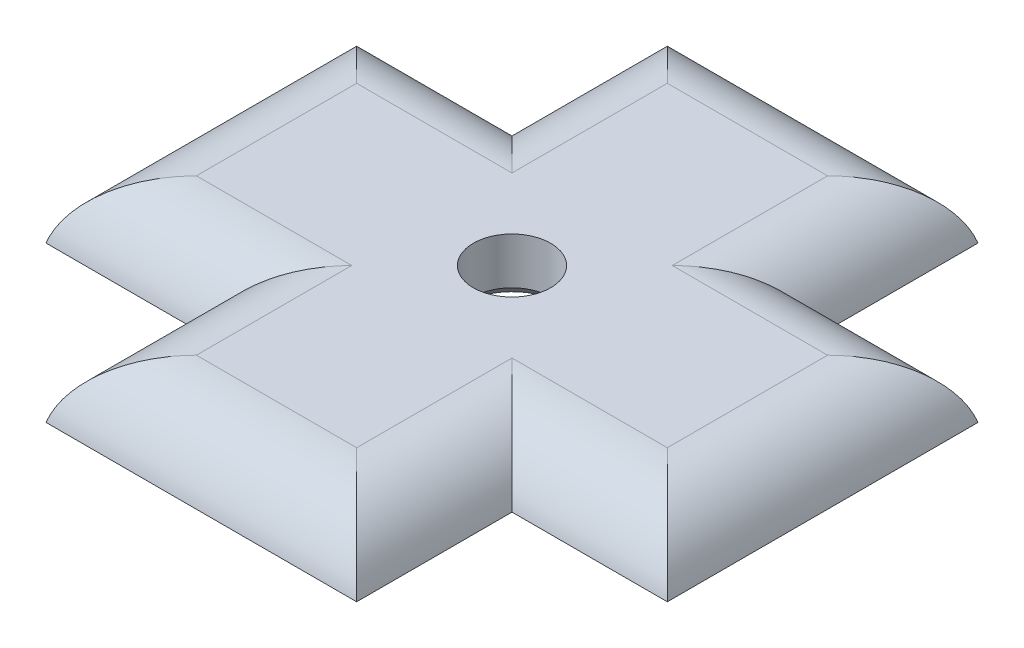
ISO-10303-21;
HEADER;
FILE_DESCRIPTION(('STEP AP214'),'2;1');
FILE_NAME('part.step','',(''),(''),'','','');
FILE_SCHEMA(('AUTOMOTIVE_DESIGN { 1 0 10303 214 1 1 1 1 }'));
ENDSEC;
DATA;
#1=APPLICATION_CONTEXT('core data for automotive mechanical design processes');
#2=APPLICATION_PROTOCOL_DEFINITION('international standard','automotive_design',2000,#1);
#3=PRODUCT_CONTEXT('',#1,'mechanical');
#4=PRODUCT('Part','Part','',(#3));
#5=PRODUCT_RELATED_PRODUCT_CATEGORY('part','',(#4));
#6=PRODUCT_DEFINITION_FORMATION('','',#4);
#7=PRODUCT_DEFINITION_CONTEXT('part definition',#1,'design');
#8=PRODUCT_DEFINITION('design','',#6,#7);
#9=PRODUCT_DEFINITION_SHAPE('','',#8);
#10=(LENGTH_UNIT() NAMED_UNIT(*) SI_UNIT(.MILLI.,.METRE.));
#11=(NAMED_UNIT(*) PLANE_ANGLE_UNIT() SI_UNIT($,.RADIAN.));
#12=(NAMED_UNIT(*) SI_UNIT($,.STERADIAN.) SOLID_ANGLE_UNIT());
#13=UNCERTAINTY_MEASURE_WITH_UNIT(LENGTH_MEASURE(1.E-05),#10,'distance_accuracy_value','');
#14=(GEOMETRIC_REPRESENTATION_CONTEXT(3) GLOBAL_UNCERTAINTY_ASSIGNED_CONTEXT((#13)) GLOBAL_UNIT_ASSIGNED_CONTEXT((#10,
#11,#12)) REPRESENTATION_CONTEXT('',''));
#15=CARTESIAN_POINT('',(0.,0.,0.));
#16=DIRECTION('',(0.,0.,1.));
#17=DIRECTION('',(1.,0.,0.));
#18=AXIS2_PLACEMENT_3D('',#15,#16,#17);
#19=CARTESIAN_POINT('',(0.,7.5,0.));
#20=DIRECTION('',(0.,1.,0.));
#21=DIRECTION('',(0.,0.,1.));
#22=AXIS2_PLACEMENT_3D('',#19,#20,#21);
#23=PLANE('',#22);
#24=CARTESIAN_POINT('',(40.,7.5,40.));
#25=DIRECTION('',(0.,1.,0.));
#26=DIRECTION('',(0.,0.,1.));
#27=AXIS2_PLACEMENT_3D('',#24,#25,#26);
#28=CIRCLE('',#27,4.975);
#29=CARTESIAN_POINT('',(40.,7.5,44.975));
#30=VERTEX_POINT('',#29);
#31=EDGE_CURVE('E165',#30,#30,#28,.T.);
#32=ORIENTED_EDGE('',*,*,#31,.F.);
#33=EDGE_LOOP('',(#32));
#34=FACE_BOUND('',#33,.T.);
#35=DIRECTION('',(-1.,0.,0.));
#36=VECTOR('',#35,1.);
#37=CARTESIAN_POINT('',(20.,7.5,9.68245836551854));
#38=LINE('',#37,#36);
#39=CARTESIAN_POINT('',(50.3175416344815,7.5,9.68245836551854));
#40=VERTEX_POINT('',#39);
#41=CARTESIAN_POINT('',(29.6824583655185,7.5,9.68245836551854));
#42=VERTEX_POINT('',#41);
#43=EDGE_CURVE('E59',#40,#42,#38,.T.);
#44=ORIENTED_EDGE('',*,*,#43,.T.);
#45=DIRECTION('',(0.,0.,-1.));
#46=VECTOR('',#45,1.);
#47=CARTESIAN_POINT('',(29.6824583655185,7.5,20.));
#48=LINE('',#47,#46);
#49=CARTESIAN_POINT('',(29.6824583655186,7.5,29.6824583655185));
#50=VERTEX_POINT('',#49);
#51=EDGE_CURVE('E230',#42,#50,#48,.F.);
#52=ORIENTED_EDGE('',*,*,#51,.T.);
#53=DIRECTION('',(-1.,0.,0.));
#54=VECTOR('',#53,1.);
#55=CARTESIAN_POINT('',(0.,7.5,29.6824583655185));
#56=LINE('',#55,#54);
#57=CARTESIAN_POINT('',(9.68245836551855,7.5,29.6824583655185));
#58=VERTEX_POINT('',#57);
#59=EDGE_CURVE('E200',#50,#58,#56,.T.);
#60=ORIENTED_EDGE('',*,*,#59,.T.);
#61=DIRECTION('',(0.,0.,-1.));
#62=VECTOR('',#61,1.);
#63=CARTESIAN_POINT('',(9.68245836551855,7.5,60.));
#64=LINE('',#63,#62);
#65=CARTESIAN_POINT('',(9.68245836551855,7.5,50.3175416344815));
#66=VERTEX_POINT('',#65);
#67=EDGE_CURVE('E203',#58,#66,#64,.F.);
#68=ORIENTED_EDGE('',*,*,#67,.T.);
#69=DIRECTION('',(-1.,0.,0.));
#70=VECTOR('',#69,1.);
#71=CARTESIAN_POINT('',(20.,7.5,50.3175416344815));
#72=LINE('',#71,#70);
#73=CARTESIAN_POINT('',(29.6824583655186,7.5,50.3175416344815));
#74=VERTEX_POINT('',#73);
#75=EDGE_CURVE('E206',#66,#74,#72,.F.);
#76=ORIENTED_EDGE('',*,*,#75,.T.);
#77=DIRECTION('',(0.,0.,1.));
#78=VECTOR('',#77,1.);
#79=CARTESIAN_POINT('',(29.6824583655186,7.5,80.));
#80=LINE('',#79,#78);
#81=CARTESIAN_POINT('',(29.6824583655186,7.5,70.3175416344815));
#82=VERTEX_POINT('',#81);
#83=EDGE_CURVE('E209',#74,#82,#80,.T.);
#84=ORIENTED_EDGE('',*,*,#83,.T.);
#85=DIRECTION('',(-1.,0.,0.));
#86=VECTOR('',#85,1.);
#87=CARTESIAN_POINT('',(60.,7.5,70.3175416344815));
#88=LINE('',#87,#86);
#89=CARTESIAN_POINT('',(50.3175416344815,7.5,70.3175416344815));
#90=VERTEX_POINT('',#89);
#91=EDGE_CURVE('E212',#82,#90,#88,.F.);
#92=ORIENTED_EDGE('',*,*,#91,.T.);
#93=DIRECTION('',(0.,0.,1.));
#94=VECTOR('',#93,1.);
#95=CARTESIAN_POINT('',(50.3175416344815,7.5,60.));
#96=LINE('',#95,#94);
#97=CARTESIAN_POINT('',(50.3175416344815,7.5,50.3175416344815));
#98=VERTEX_POINT('',#97);
#99=EDGE_CURVE('E149',#90,#98,#96,.F.);
#100=ORIENTED_EDGE('',*,*,#99,.T.);
#101=DIRECTION('',(1.,0.,0.));
#102=VECTOR('',#101,1.);
#103=CARTESIAN_POINT('',(80.,7.5,50.3175416344815));
#104=LINE('',#103,#102);
#105=CARTESIAN_POINT('',(70.3175416344815,7.5,50.3175416344815));
#106=VERTEX_POINT('',#105);
#107=EDGE_CURVE('E217',#98,#106,#104,.T.);
#108=ORIENTED_EDGE('',*,*,#107,.T.);
#109=DIRECTION('',(0.,0.,-1.));
#110=VECTOR('',#109,1.);
#111=CARTESIAN_POINT('',(70.3175416344815,7.5,20.));
#112=LINE('',#111,#110);
#113=CARTESIAN_POINT('',(70.3175416344815,7.5,29.6824583655186));
#114=VERTEX_POINT('',#113);
#115=EDGE_CURVE('E220',#106,#114,#112,.T.);
#116=ORIENTED_EDGE('',*,*,#115,.T.);
#117=DIRECTION('',(1.,0.,0.));
#118=VECTOR('',#117,1.);
#119=CARTESIAN_POINT('',(60.,7.5,29.6824583655186));
#120=LINE('',#119,#118);
#121=CARTESIAN_POINT('',(50.3175416344815,7.5,29.6824583655186));
#122=VERTEX_POINT('',#121);
#123=EDGE_CURVE('E223',#114,#122,#120,.F.);
#124=ORIENTED_EDGE('',*,*,#123,.T.);
#125=DIRECTION('',(0.,0.,-1.));
#126=VECTOR('',#125,1.);
#127=CARTESIAN_POINT('',(50.3175416344815,7.5,0.));
#128=LINE('',#127,#126);
#129=EDGE_CURVE('E64',#122,#40,#128,.T.);
#130=ORIENTED_EDGE('',*,*,#129,.T.);
#131=EDGE_LOOP('',(#44,#52,#60,#68,#76,#84,#92,#100,#108,#116,#124,#130));
#132=FACE_BOUND('',#131,.T.);
#133=ADVANCED_FACE('F42',(#34,#132),#23,.T.);
#134=CARTESIAN_POINT('',(0.,0.,0.));
#135=DIRECTION('',(0.,1.,0.));
#136=DIRECTION('',(0.,0.,1.));
#137=AXIS2_PLACEMENT_3D('',#134,#135,#136);
#138=PLANE('',#137);
#139=CARTESIAN_POINT('',(40.,0.,40.));
#140=DIRECTION('',(0.,1.,0.));
#141=DIRECTION('',(0.,0.,1.));
#142=AXIS2_PLACEMENT_3D('',#139,#140,#141);
#143=CIRCLE('',#142,6.47500000000001);
#144=CARTESIAN_POINT('',(40.,0.,46.475));
#145=VERTEX_POINT('',#144);
#146=EDGE_CURVE('E52',#145,#145,#143,.T.);
#147=ORIENTED_EDGE('',*,*,#146,.T.);
#148=EDGE_LOOP('',(#147));
#149=FACE_BOUND('',#148,.T.);
#150=DIRECTION('',(1.,0.,0.));
#151=VECTOR('',#150,1.);
#152=CARTESIAN_POINT('',(0.,0.,80.));
#153=LINE('',#152,#151);
#154=CARTESIAN_POINT('',(20.,0.,80.));
#155=VERTEX_POINT('',#154);
#156=CARTESIAN_POINT('',(60.,0.,80.));
#157=VERTEX_POINT('',#156);
#158=EDGE_CURVE('E136',#155,#157,#153,.T.);
#159=ORIENTED_EDGE('',*,*,#158,.F.);
#160=DIRECTION('',(0.,0.,-1.));
#161=VECTOR('',#160,1.);
#162=CARTESIAN_POINT('',(20.,0.,0.));
#163=LINE('',#162,#161);
#164=CARTESIAN_POINT('',(20.,0.,60.));
#165=VERTEX_POINT('',#164);
#166=EDGE_CURVE('E197',#155,#165,#163,.T.);
#167=ORIENTED_EDGE('',*,*,#166,.T.);
#168=DIRECTION('',(1.,0.,0.));
#169=VECTOR('',#168,1.);
#170=CARTESIAN_POINT('',(0.,0.,60.));
#171=LINE('',#170,#169);
#172=CARTESIAN_POINT('',(0.,0.,60.));
#173=VERTEX_POINT('',#172);
#174=EDGE_CURVE('E193',#173,#165,#171,.T.);
#175=ORIENTED_EDGE('',*,*,#174,.F.);
#176=DIRECTION('',(0.,0.,1.));
#177=VECTOR('',#176,1.);
#178=CARTESIAN_POINT('',(0.,0.,0.));
#179=LINE('',#178,#177);
#180=CARTESIAN_POINT('',(0.,0.,20.));
#181=VERTEX_POINT('',#180);
#182=EDGE_CURVE('E189',#181,#173,#179,.T.);
#183=ORIENTED_EDGE('',*,*,#182,.F.);
#184=DIRECTION('',(1.,0.,0.));
#185=VECTOR('',#184,1.);
#186=CARTESIAN_POINT('',(0.,0.,20.));
#187=LINE('',#186,#185);
#188=CARTESIAN_POINT('',(20.,0.,20.));
#189=VERTEX_POINT('',#188);
#190=EDGE_CURVE('E186',#181,#189,#187,.T.);
#191=ORIENTED_EDGE('',*,*,#190,.T.);
#192=DIRECTION('',(0.,0.,1.));
#193=VECTOR('',#192,1.);
#194=CARTESIAN_POINT('',(20.,0.,0.));
#195=LINE('',#194,#193);
#196=CARTESIAN_POINT('',(20.,0.,0.));
#197=VERTEX_POINT('',#196);
#198=EDGE_CURVE('E182',#197,#189,#195,.T.);
#199=ORIENTED_EDGE('',*,*,#198,.F.);
#200=DIRECTION('',(1.,0.,0.));
#201=VECTOR('',#200,1.);
#202=CARTESIAN_POINT('',(0.,0.,0.));
#203=LINE('',#202,#201);
#204=CARTESIAN_POINT('',(60.,0.,0.));
#205=VERTEX_POINT('',#204);
#206=EDGE_CURVE('E179',#197,#205,#203,.T.);
#207=ORIENTED_EDGE('',*,*,#206,.T.);
#208=DIRECTION('',(0.,0.,1.));
#209=VECTOR('',#208,1.);
#210=CARTESIAN_POINT('',(60.,0.,0.));
#211=LINE('',#210,#209);
#212=CARTESIAN_POINT('',(60.,0.,20.));
#213=VERTEX_POINT('',#212);
#214=EDGE_CURVE('E176',#205,#213,#211,.T.);
#215=ORIENTED_EDGE('',*,*,#214,.T.);
#216=DIRECTION('',(-1.,0.,0.));
#217=VECTOR('',#216,1.);
#218=CARTESIAN_POINT('',(0.,0.,20.));
#219=LINE('',#218,#217);
#220=CARTESIAN_POINT('',(80.,0.,20.));
#221=VERTEX_POINT('',#220);
#222=EDGE_CURVE('E172',#221,#213,#219,.T.);
#223=ORIENTED_EDGE('',*,*,#222,.F.);
#224=DIRECTION('',(0.,0.,1.));
#225=VECTOR('',#224,1.);
#226=CARTESIAN_POINT('',(80.,0.,0.));
#227=LINE('',#226,#225);
#228=CARTESIAN_POINT('',(80.,0.,60.));
#229=VERTEX_POINT('',#228);
#230=EDGE_CURVE('E169',#221,#229,#227,.T.);
#231=ORIENTED_EDGE('',*,*,#230,.T.);
#232=DIRECTION('',(-1.,0.,0.));
#233=VECTOR('',#232,1.);
#234=CARTESIAN_POINT('',(0.,0.,60.));
#235=LINE('',#234,#233);
#236=CARTESIAN_POINT('',(60.,0.,60.));
#237=VERTEX_POINT('',#236);
#238=EDGE_CURVE('E139',#229,#237,#235,.T.);
#239=ORIENTED_EDGE('',*,*,#238,.T.);
#240=DIRECTION('',(0.,0.,-1.));
#241=VECTOR('',#240,1.);
#242=CARTESIAN_POINT('',(60.,0.,0.));
#243=LINE('',#242,#241);
#244=EDGE_CURVE('E132',#157,#237,#243,.T.);
#245=ORIENTED_EDGE('',*,*,#244,.F.);
#246=EDGE_LOOP('',(#159,#167,#175,#183,#191,#199,#207,#215,#223,#231,#239,#245));
#247=FACE_BOUND('',#246,.T.);
#248=ADVANCED_FACE('F134',(#149,#247),#138,.F.);
#249=CARTESIAN_POINT('',(50.3175416344815,-2.5,0.));
#250=DIRECTION('',(0.,0.,-1.));
#251=DIRECTION('',(-1.,0.,0.));
#252=AXIS2_PLACEMENT_3D('',#249,#250,#251);
#253=CYLINDRICAL_SURFACE('',#252,10.);
#254=CARTESIAN_POINT('',(50.3175416344815,-2.5,70.3175416344815));
#255=DIRECTION('',(0.707106781186547,0.,-0.707106781186547));
#256=DIRECTION('',(0.707106781186547,0.,0.707106781186547));
#257=AXIS2_PLACEMENT_3D('',#254,#255,#256);
#258=ELLIPSE('',#257,14.1421356237309,10.);
#259=EDGE_CURVE('E147',#157,#90,#258,.F.);
#260=ORIENTED_EDGE('',*,*,#259,.F.);
#261=ORIENTED_EDGE('',*,*,#244,.T.);
#262=CARTESIAN_POINT('',(50.3175416344815,-2.5,50.3175416344815));
#263=DIRECTION('',(-0.707106781186547,0.,0.707106781186547));
#264=DIRECTION('',(-0.707106781186547,0.,-0.707106781186547));
#265=AXIS2_PLACEMENT_3D('',#262,#263,#264);
#266=ELLIPSE('',#265,14.1421356237309,10.);
#267=EDGE_CURVE('E153',#98,#237,#266,.F.);
#268=ORIENTED_EDGE('',*,*,#267,.F.);
#269=ORIENTED_EDGE('',*,*,#99,.F.);
#270=EDGE_LOOP('',(#260,#261,#268,#269));
#271=FACE_BOUND('',#270,.T.);
#272=ADVANCED_FACE('F148',(#271),#253,.T.);
#273=CARTESIAN_POINT('',(0.,-2.5,50.3175416344815));
#274=DIRECTION('',(-1.,0.,0.));
#275=DIRECTION('',(0.,0.,1.));
#276=AXIS2_PLACEMENT_3D('',#273,#274,#275);
#277=CYLINDRICAL_SURFACE('',#276,10.);
#278=ORIENTED_EDGE('',*,*,#267,.T.);
#279=ORIENTED_EDGE('',*,*,#238,.F.);
#280=CARTESIAN_POINT('',(70.3175416344815,-2.5,50.3175416344815));
#281=DIRECTION('',(-0.707106781186547,0.,0.707106781186548));
#282=DIRECTION('',(-0.707106781186548,0.,-0.707106781186547));
#283=AXIS2_PLACEMENT_3D('',#280,#281,#282);
#284=ELLIPSE('',#283,14.142135623731,10.);
#285=EDGE_CURVE('E154',#106,#229,#284,.F.);
#286=ORIENTED_EDGE('',*,*,#285,.F.);
#287=ORIENTED_EDGE('',*,*,#107,.F.);
#288=EDGE_LOOP('',(#278,#279,#286,#287));
#289=FACE_BOUND('',#288,.T.);
#290=ADVANCED_FACE('F330',(#289),#277,.T.);
#291=CARTESIAN_POINT('',(0.,-2.5,70.3175416344815));
#292=DIRECTION('',(1.,0.,0.));
#293=DIRECTION('',(0.,0.,-1.));
#294=AXIS2_PLACEMENT_3D('',#291,#292,#293);
#295=CYLINDRICAL_SURFACE('',#294,10.);
#296=ORIENTED_EDGE('',*,*,#259,.T.);
#297=ORIENTED_EDGE('',*,*,#91,.F.);
#298=CARTESIAN_POINT('',(29.6824583655186,-2.5,70.3175416344815));
#299=DIRECTION('',(-0.707106781186547,0.,-0.707106781186547));
#300=DIRECTION('',(0.707106781186547,0.,-0.707106781186547));
#301=AXIS2_PLACEMENT_3D('',#298,#299,#300);
#302=ELLIPSE('',#301,14.1421356237309,10.);
#303=EDGE_CURVE('E158',#155,#82,#302,.T.);
#304=ORIENTED_EDGE('',*,*,#303,.F.);
#305=ORIENTED_EDGE('',*,*,#158,.T.);
#306=EDGE_LOOP('',(#296,#297,#304,#305));
#307=FACE_BOUND('',#306,.T.);
#308=ADVANCED_FACE('F156',(#307),#295,.T.);
#309=CARTESIAN_POINT('',(70.3175416344815,-2.5,0.));
#310=DIRECTION('',(0.,0.,1.));
#311=DIRECTION('',(1.,0.,0.));
#312=AXIS2_PLACEMENT_3D('',#309,#310,#311);
#313=CYLINDRICAL_SURFACE('',#312,10.);
#314=ORIENTED_EDGE('',*,*,#285,.T.);
#315=ORIENTED_EDGE('',*,*,#230,.F.);
#316=CARTESIAN_POINT('',(70.3175416344815,-2.5,29.6824583655185));
#317=DIRECTION('',(0.707106781186548,0.,0.707106781186547));
#318=DIRECTION('',(-0.707106781186547,0.,0.707106781186548));
#319=AXIS2_PLACEMENT_3D('',#316,#317,#318);
#320=ELLIPSE('',#319,14.142135623731,10.);
#321=EDGE_CURVE('E259',#114,#221,#320,.F.);
#322=ORIENTED_EDGE('',*,*,#321,.F.);
#323=ORIENTED_EDGE('',*,*,#115,.F.);
#324=EDGE_LOOP('',(#314,#315,#322,#323));
#325=FACE_BOUND('',#324,.T.);
#326=ADVANCED_FACE('F323',(#325),#313,.T.);
#327=CARTESIAN_POINT('',(29.6824583655186,-2.5,0.));
#328=DIRECTION('',(0.,0.,-1.));
#329=DIRECTION('',(-1.,0.,0.));
#330=AXIS2_PLACEMENT_3D('',#327,#328,#329);
#331=CYLINDRICAL_SURFACE('',#330,10.);
#332=ORIENTED_EDGE('',*,*,#303,.T.);
#333=ORIENTED_EDGE('',*,*,#83,.F.);
#334=CARTESIAN_POINT('',(29.6824583655186,-2.5,50.3175416344815));
#335=DIRECTION('',(-0.707106781186547,0.,-0.707106781186547));
#336=DIRECTION('',(0.707106781186547,0.,-0.707106781186547));
#337=AXIS2_PLACEMENT_3D('',#334,#335,#336);
#338=ELLIPSE('',#337,14.1421356237309,10.);
#339=EDGE_CURVE('E255',#165,#74,#338,.T.);
#340=ORIENTED_EDGE('',*,*,#339,.F.);
#341=ORIENTED_EDGE('',*,*,#166,.F.);
#342=EDGE_LOOP('',(#332,#333,#340,#341));
#343=FACE_BOUND('',#342,.T.);
#344=ADVANCED_FACE('F319',(#343),#331,.T.);
#345=CARTESIAN_POINT('',(0.,-2.5,29.6824583655186));
#346=DIRECTION('',(-1.,0.,0.));
#347=DIRECTION('',(0.,0.,1.));
#348=AXIS2_PLACEMENT_3D('',#345,#346,#347);
#349=CYLINDRICAL_SURFACE('',#348,10.);
#350=ORIENTED_EDGE('',*,*,#321,.T.);
#351=ORIENTED_EDGE('',*,*,#222,.T.);
#352=CARTESIAN_POINT('',(50.3175416344815,-2.5,29.6824583655186));
#353=DIRECTION('',(0.707106781186548,0.,0.707106781186547));
#354=DIRECTION('',(-0.707106781186547,0.,0.707106781186548));
#355=AXIS2_PLACEMENT_3D('',#352,#353,#354);
#356=ELLIPSE('',#355,14.142135623731,10.);
#357=EDGE_CURVE('E251',#122,#213,#356,.F.);
#358=ORIENTED_EDGE('',*,*,#357,.F.);
#359=ORIENTED_EDGE('',*,*,#123,.F.);
#360=EDGE_LOOP('',(#350,#351,#358,#359));
#361=FACE_BOUND('',#360,.T.);
#362=ADVANCED_FACE('F315',(#361),#349,.T.);
#363=CARTESIAN_POINT('',(0.,-2.5,50.3175416344815));
#364=DIRECTION('',(1.,0.,0.));
#365=DIRECTION('',(0.,0.,-1.));
#366=AXIS2_PLACEMENT_3D('',#363,#364,#365);
#367=CYLINDRICAL_SURFACE('',#366,10.);
#368=ORIENTED_EDGE('',*,*,#339,.T.);
#369=ORIENTED_EDGE('',*,*,#75,.F.);
#370=CARTESIAN_POINT('',(9.68245836551855,-2.5,50.3175416344815));
#371=DIRECTION('',(0.707106781186548,0.,0.707106781186547));
#372=DIRECTION('',(-0.707106781186547,0.,0.707106781186548));
#373=AXIS2_PLACEMENT_3D('',#370,#371,#372);
#374=ELLIPSE('',#373,14.1421356237309,10.);
#375=EDGE_CURVE('E247',#173,#66,#374,.F.);
#376=ORIENTED_EDGE('',*,*,#375,.F.);
#377=ORIENTED_EDGE('',*,*,#174,.T.);
#378=EDGE_LOOP('',(#368,#369,#376,#377));
#379=FACE_BOUND('',#378,.T.);
#380=ADVANCED_FACE('F311',(#379),#367,.T.);
#381=CARTESIAN_POINT('',(50.3175416344815,-2.5,0.));
#382=DIRECTION('',(0.,0.,1.));
#383=DIRECTION('',(1.,0.,0.));
#384=AXIS2_PLACEMENT_3D('',#381,#382,#383);
#385=CYLINDRICAL_SURFACE('',#384,10.);
#386=ORIENTED_EDGE('',*,*,#357,.T.);
#387=ORIENTED_EDGE('',*,*,#214,.F.);
#388=CARTESIAN_POINT('',(50.3175416344815,-2.5,9.68245836551854));
#389=DIRECTION('',(0.707106781186547,0.,0.707106781186547));
#390=DIRECTION('',(-0.707106781186547,0.,0.707106781186547));
#391=AXIS2_PLACEMENT_3D('',#388,#389,#390);
#392=ELLIPSE('',#391,14.1421356237309,10.);
#393=EDGE_CURVE('E243',#40,#205,#392,.F.);
#394=ORIENTED_EDGE('',*,*,#393,.F.);
#395=ORIENTED_EDGE('',*,*,#129,.F.);
#396=EDGE_LOOP('',(#386,#387,#394,#395));
#397=FACE_BOUND('',#396,.T.);
#398=ADVANCED_FACE('F307',(#397),#385,.T.);
#399=CARTESIAN_POINT('',(9.68245836551854,-2.5,0.));
#400=DIRECTION('',(0.,0.,1.));
#401=DIRECTION('',(1.,0.,0.));
#402=AXIS2_PLACEMENT_3D('',#399,#400,#401);
#403=CYLINDRICAL_SURFACE('',#402,10.);
#404=ORIENTED_EDGE('',*,*,#375,.T.);
#405=ORIENTED_EDGE('',*,*,#67,.F.);
#406=CARTESIAN_POINT('',(9.68245836551855,-2.5,29.6824583655185));
#407=DIRECTION('',(0.707106781186547,0.,-0.707106781186548));
#408=DIRECTION('',(0.707106781186548,0.,0.707106781186547));
#409=AXIS2_PLACEMENT_3D('',#406,#407,#408);
#410=ELLIPSE('',#409,14.142135623731,10.);
#411=EDGE_CURVE('E239',#181,#58,#410,.T.);
#412=ORIENTED_EDGE('',*,*,#411,.F.);
#413=ORIENTED_EDGE('',*,*,#182,.T.);
#414=EDGE_LOOP('',(#404,#405,#412,#413));
#415=FACE_BOUND('',#414,.T.);
#416=ADVANCED_FACE('F303',(#415),#403,.T.);
#417=CARTESIAN_POINT('',(0.,-2.5,9.68245836551854));
#418=DIRECTION('',(1.,0.,0.));
#419=DIRECTION('',(0.,0.,-1.));
#420=AXIS2_PLACEMENT_3D('',#417,#418,#419);
#421=CYLINDRICAL_SURFACE('',#420,10.);
#422=ORIENTED_EDGE('',*,*,#393,.T.);
#423=ORIENTED_EDGE('',*,*,#206,.F.);
#424=CARTESIAN_POINT('',(29.6824583655185,-2.5,9.68245836551854));
#425=DIRECTION('',(0.707106781186547,0.,-0.707106781186548));
#426=DIRECTION('',(0.707106781186548,0.,0.707106781186547));
#427=AXIS2_PLACEMENT_3D('',#424,#425,#426);
#428=ELLIPSE('',#427,14.142135623731,10.);
#429=EDGE_CURVE('E236',#42,#197,#428,.F.);
#430=ORIENTED_EDGE('',*,*,#429,.F.);
#431=ORIENTED_EDGE('',*,*,#43,.F.);
#432=EDGE_LOOP('',(#422,#423,#430,#431));
#433=FACE_BOUND('',#432,.T.);
#434=ADVANCED_FACE('F299',(#433),#421,.T.);
#435=CARTESIAN_POINT('',(0.,-2.5,29.6824583655185));
#436=DIRECTION('',(1.,0.,0.));
#437=DIRECTION('',(0.,0.,-1.));
#438=AXIS2_PLACEMENT_3D('',#435,#436,#437);
#439=CYLINDRICAL_SURFACE('',#438,10.);
#440=ORIENTED_EDGE('',*,*,#411,.T.);
#441=ORIENTED_EDGE('',*,*,#59,.F.);
#442=CARTESIAN_POINT('',(29.6824583655186,-2.5,29.6824583655185));
#443=DIRECTION('',(-0.707106781186547,0.,0.707106781186548));
#444=DIRECTION('',(0.707106781186548,0.,0.707106781186547));
#445=AXIS2_PLACEMENT_3D('',#442,#443,#444);
#446=ELLIPSE('',#445,14.142135623731,10.);
#447=EDGE_CURVE('E233',#189,#50,#446,.F.);
#448=ORIENTED_EDGE('',*,*,#447,.F.);
#449=ORIENTED_EDGE('',*,*,#190,.F.);
#450=EDGE_LOOP('',(#440,#441,#448,#449));
#451=FACE_BOUND('',#450,.T.);
#452=ADVANCED_FACE('F295',(#451),#439,.T.);
#453=CARTESIAN_POINT('',(29.6824583655185,-2.5,0.));
#454=DIRECTION('',(0.,0.,1.));
#455=DIRECTION('',(1.,0.,0.));
#456=AXIS2_PLACEMENT_3D('',#453,#454,#455);
#457=CYLINDRICAL_SURFACE('',#456,10.);
#458=ORIENTED_EDGE('',*,*,#429,.T.);
#459=ORIENTED_EDGE('',*,*,#198,.T.);
#460=ORIENTED_EDGE('',*,*,#447,.T.);
#461=ORIENTED_EDGE('',*,*,#51,.F.);
#462=EDGE_LOOP('',(#458,#459,#460,#461));
#463=FACE_BOUND('',#462,.T.);
#464=ADVANCED_FACE('F279',(#463),#457,.T.);
#465=CARTESIAN_POINT('',(40.,7.5,40.));
#466=DIRECTION('',(0.,-1.,0.));
#467=DIRECTION('',(0.,0.,-1.));
#468=AXIS2_PLACEMENT_3D('',#465,#466,#467);
#469=CYLINDRICAL_SURFACE('',#468,4.975);
#470=CARTESIAN_POINT('',(40.,1.50000000000002,40.));
#471=DIRECTION('',(0.,1.,0.));
#472=DIRECTION('',(0.,0.,1.));
#473=AXIS2_PLACEMENT_3D('',#470,#471,#472);
#474=CIRCLE('',#473,4.975);
#475=CARTESIAN_POINT('',(40.,1.50000000000002,44.975));
#476=VERTEX_POINT('',#475);
#477=EDGE_CURVE('E11',#476,#476,#474,.F.);
#478=ORIENTED_EDGE('',*,*,#477,.T.);
#479=EDGE_LOOP('',(#478));
#480=FACE_BOUND('',#479,.T.);
#481=ORIENTED_EDGE('',*,*,#31,.T.);
#482=EDGE_LOOP('',(#481));
#483=FACE_BOUND('',#482,.T.);
#484=ADVANCED_FACE('F273',(#480,#483),#469,.F.);
#485=CARTESIAN_POINT('',(40.,0.,40.));
#486=DIRECTION('',(0.,-1.,0.));
#487=DIRECTION('',(0.,0.,-1.));
#488=AXIS2_PLACEMENT_3D('',#485,#486,#487);
#489=CONICAL_SURFACE('',#488,6.47500000000001,0.785398163397444);
#490=ORIENTED_EDGE('',*,*,#477,.F.);
#491=EDGE_LOOP('',(#490));
#492=FACE_BOUND('',#491,.T.);
#493=ORIENTED_EDGE('',*,*,#146,.F.);
#494=EDGE_LOOP('',(#493));
#495=FACE_BOUND('',#494,.T.);
#496=ADVANCED_FACE('F45',(#492,#495),#489,.F.);
#497=CLOSED_SHELL('',(#133,#248,#272,#290,#308,#326,#344,#362,#380,#398,#416,#434,#452,#464,
#484,#496));
#498=MANIFOLD_SOLID_BREP('B2',#497);
#499=ADVANCED_BREP_SHAPE_REPRESENTATION('',(#18,#498),#14);
#500=SHAPE_DEFINITION_REPRESENTATION(#9,#499);
ENDSEC;
END-ISO-10303-21;
